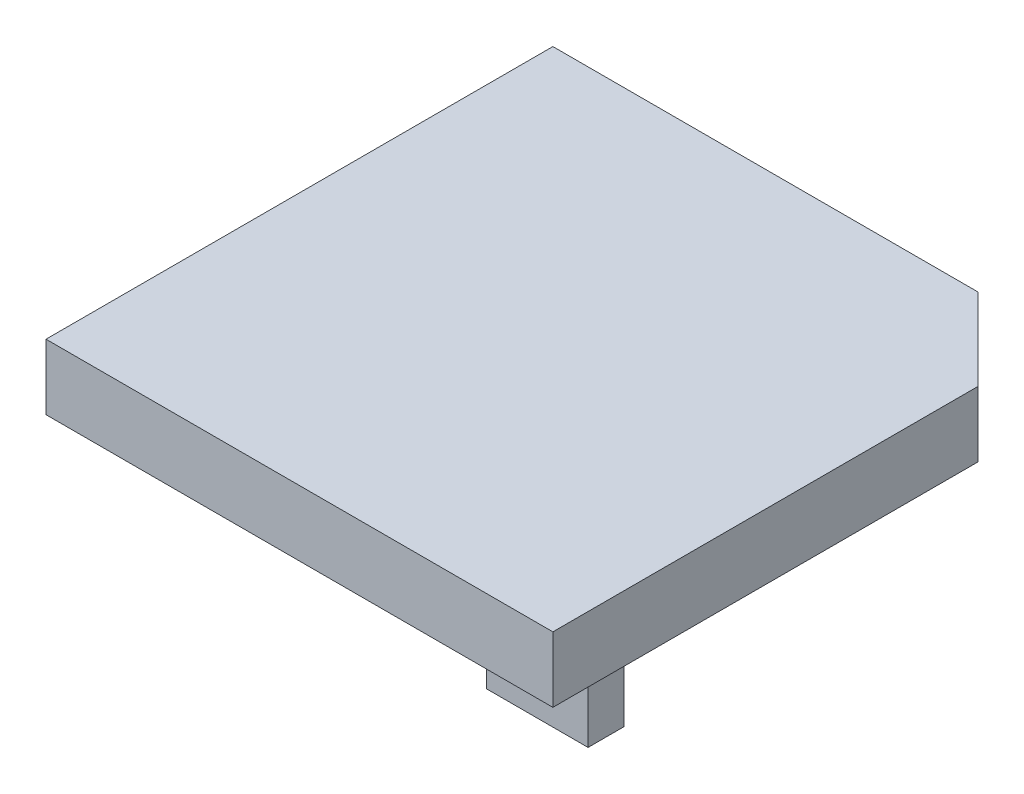
ISO-10303-21;
HEADER;
FILE_DESCRIPTION(('STEP AP214'),'2;1');
FILE_NAME('part.step','',(''),(''),'','','');
FILE_SCHEMA(('AUTOMOTIVE_DESIGN { 1 0 10303 214 1 1 1 1 }'));
ENDSEC;
DATA;
#1=APPLICATION_CONTEXT('core data for automotive mechanical design processes');
#2=APPLICATION_PROTOCOL_DEFINITION('international standard','automotive_design',2000,#1);
#3=PRODUCT_CONTEXT('',#1,'mechanical');
#4=PRODUCT('Part','Part','',(#3));
#5=PRODUCT_RELATED_PRODUCT_CATEGORY('part','',(#4));
#6=PRODUCT_DEFINITION_FORMATION('','',#4);
#7=PRODUCT_DEFINITION_CONTEXT('part definition',#1,'design');
#8=PRODUCT_DEFINITION('design','',#6,#7);
#9=PRODUCT_DEFINITION_SHAPE('','',#8);
#10=(LENGTH_UNIT() NAMED_UNIT(*) SI_UNIT(.MILLI.,.METRE.));
#11=(NAMED_UNIT(*) PLANE_ANGLE_UNIT() SI_UNIT($,.RADIAN.));
#12=(NAMED_UNIT(*) SI_UNIT($,.STERADIAN.) SOLID_ANGLE_UNIT());
#13=UNCERTAINTY_MEASURE_WITH_UNIT(LENGTH_MEASURE(1.E-05),#10,'distance_accuracy_value','');
#14=(GEOMETRIC_REPRESENTATION_CONTEXT(3) GLOBAL_UNCERTAINTY_ASSIGNED_CONTEXT((#13)) GLOBAL_UNIT_ASSIGNED_CONTEXT((#10,
#11,#12)) REPRESENTATION_CONTEXT('',''));
#15=CARTESIAN_POINT('',(0.,0.,0.));
#16=DIRECTION('',(0.,0.,1.));
#17=DIRECTION('',(1.,0.,0.));
#18=AXIS2_PLACEMENT_3D('',#15,#16,#17);
#19=CARTESIAN_POINT('',(0.,0.,0.));
#20=DIRECTION('',(0.,-1.,0.));
#21=DIRECTION('',(0.,0.,-1.));
#22=AXIS2_PLACEMENT_3D('',#19,#20,#21);
#23=PLANE('',#22);
#24=DIRECTION('',(-1.,0.,0.));
#25=VECTOR('',#24,1.);
#26=CARTESIAN_POINT('',(-9.8425,0.,-9.84250000000001));
#27=LINE('',#26,#25);
#28=CARTESIAN_POINT('',(6.6675,0.,-9.84250000000001));
#29=VERTEX_POINT('',#28);
#30=CARTESIAN_POINT('',(-9.8425,0.,-9.84250000000001));
#31=VERTEX_POINT('',#30);
#32=EDGE_CURVE('E227',#29,#31,#27,.T.);
#33=ORIENTED_EDGE('',*,*,#32,.F.);
#34=DIRECTION('',(-0.707106781186546,0.,-0.707106781186549));
#35=VECTOR('',#34,1.);
#36=CARTESIAN_POINT('',(8.25500000000001,0.,-8.25499999999999));
#37=LINE('',#36,#35);
#38=CARTESIAN_POINT('',(9.8425,0.,-6.6675));
#39=VERTEX_POINT('',#38);
#40=EDGE_CURVE('E62',#29,#39,#37,.F.);
#41=ORIENTED_EDGE('',*,*,#40,.T.);
#42=DIRECTION('',(0.,0.,-1.));
#43=VECTOR('',#42,1.);
#44=CARTESIAN_POINT('',(9.8425,0.,9.84249999999999));
#45=LINE('',#44,#43);
#46=CARTESIAN_POINT('',(9.8425,0.,9.84249999999999));
#47=VERTEX_POINT('',#46);
#48=EDGE_CURVE('E210',#47,#39,#45,.T.);
#49=ORIENTED_EDGE('',*,*,#48,.F.);
#50=DIRECTION('',(1.,0.,0.));
#51=VECTOR('',#50,1.);
#52=CARTESIAN_POINT('',(-9.8425,0.,9.8425));
#53=LINE('',#52,#51);
#54=CARTESIAN_POINT('',(-9.8425,0.,9.8425));
#55=VERTEX_POINT('',#54);
#56=EDGE_CURVE('E215',#55,#47,#53,.T.);
#57=ORIENTED_EDGE('',*,*,#56,.F.);
#58=DIRECTION('',(0.,0.,1.));
#59=VECTOR('',#58,1.);
#60=CARTESIAN_POINT('',(-9.8425,0.,9.8425));
#61=LINE('',#60,#59);
#62=EDGE_CURVE('E230',#31,#55,#61,.T.);
#63=ORIENTED_EDGE('',*,*,#62,.F.);
#64=EDGE_LOOP('',(#33,#41,#49,#57,#63));
#65=FACE_BOUND('',#64,.T.);
#66=DIRECTION('',(-1.,0.,0.));
#67=VECTOR('',#66,1.);
#68=CARTESIAN_POINT('',(-5.68325,0.,-3.11150000000001));
#69=LINE('',#68,#67);
#70=CARTESIAN_POINT('',(-4.28625,0.,-3.11150000000001));
#71=VERTEX_POINT('',#70);
#72=CARTESIAN_POINT('',(-5.68325,0.,-3.11150000000001));
#73=VERTEX_POINT('',#72);
#74=EDGE_CURVE('E168',#71,#73,#69,.T.);
#75=ORIENTED_EDGE('',*,*,#74,.F.);
#76=DIRECTION('',(0.,0.,1.));
#77=VECTOR('',#76,1.);
#78=CARTESIAN_POINT('',(-4.28625,0.,-7.04850000000001));
#79=LINE('',#78,#77);
#80=CARTESIAN_POINT('',(-4.28625,0.,-7.04850000000001));
#81=VERTEX_POINT('',#80);
#82=EDGE_CURVE('E163',#81,#71,#79,.T.);
#83=ORIENTED_EDGE('',*,*,#82,.F.);
#84=DIRECTION('',(1.,0.,0.));
#85=VECTOR('',#84,1.);
#86=CARTESIAN_POINT('',(-5.68325,0.,-7.04850000000001));
#87=LINE('',#86,#85);
#88=CARTESIAN_POINT('',(-5.68325,0.,-7.04850000000001));
#89=VERTEX_POINT('',#88);
#90=EDGE_CURVE('E179',#89,#81,#87,.T.);
#91=ORIENTED_EDGE('',*,*,#90,.F.);
#92=DIRECTION('',(0.,0.,-1.));
#93=VECTOR('',#92,1.);
#94=CARTESIAN_POINT('',(-5.68325,0.,-7.04850000000001));
#95=LINE('',#94,#93);
#96=EDGE_CURVE('E191',#73,#89,#95,.T.);
#97=ORIENTED_EDGE('',*,*,#96,.F.);
#98=EDGE_LOOP('',(#75,#83,#91,#97));
#99=FACE_BOUND('',#98,.T.);
#100=DIRECTION('',(-1.,0.,0.));
#101=VECTOR('',#100,1.);
#102=CARTESIAN_POINT('',(3.3655,0.,5.93598));
#103=LINE('',#102,#101);
#104=CARTESIAN_POINT('',(7.3025,0.,5.93598));
#105=VERTEX_POINT('',#104);
#106=CARTESIAN_POINT('',(3.3655,0.,5.93598));
#107=VERTEX_POINT('',#106);
#108=EDGE_CURVE('E432',#105,#107,#103,.T.);
#109=ORIENTED_EDGE('',*,*,#108,.F.);
#110=DIRECTION('',(0.,0.,1.));
#111=VECTOR('',#110,1.);
#112=CARTESIAN_POINT('',(7.3025,0.,4.53898));
#113=LINE('',#112,#111);
#114=CARTESIAN_POINT('',(7.3025,0.,4.53898));
#115=VERTEX_POINT('',#114);
#116=EDGE_CURVE('E160',#115,#105,#113,.T.);
#117=ORIENTED_EDGE('',*,*,#116,.F.);
#118=DIRECTION('',(1.,0.,0.));
#119=VECTOR('',#118,1.);
#120=CARTESIAN_POINT('',(3.3655,0.,4.53898));
#121=LINE('',#120,#119);
#122=CARTESIAN_POINT('',(3.3655,0.,4.53898));
#123=VERTEX_POINT('',#122);
#124=EDGE_CURVE('E156',#123,#115,#121,.T.);
#125=ORIENTED_EDGE('',*,*,#124,.F.);
#126=DIRECTION('',(0.,0.,-1.));
#127=VECTOR('',#126,1.);
#128=CARTESIAN_POINT('',(3.3655,0.,4.53898));
#129=LINE('',#128,#127);
#130=EDGE_CURVE('E428',#107,#123,#129,.T.);
#131=ORIENTED_EDGE('',*,*,#130,.F.);
#132=EDGE_LOOP('',(#109,#117,#125,#131));
#133=FACE_BOUND('',#132,.T.);
#134=ADVANCED_FACE('F39',(#65,#99,#133),#23,.T.);
#135=CARTESIAN_POINT('',(9.8425,2.54,9.84249999999999));
#136=DIRECTION('',(-1.,0.,0.));
#137=DIRECTION('',(0.,0.,1.));
#138=AXIS2_PLACEMENT_3D('',#135,#136,#137);
#139=PLANE('',#138);
#140=ORIENTED_EDGE('',*,*,#48,.T.);
#141=DIRECTION('',(0.,1.,0.));
#142=VECTOR('',#141,1.);
#143=CARTESIAN_POINT('',(9.8425,2.54,-6.6675));
#144=LINE('',#143,#142);
#145=CARTESIAN_POINT('',(9.8425,2.54,-6.6675));
#146=VERTEX_POINT('',#145);
#147=EDGE_CURVE('E48',#39,#146,#144,.T.);
#148=ORIENTED_EDGE('',*,*,#147,.T.);
#149=DIRECTION('',(0.,0.,-1.));
#150=VECTOR('',#149,1.);
#151=CARTESIAN_POINT('',(9.8425,2.54,9.84249999999999));
#152=LINE('',#151,#150);
#153=CARTESIAN_POINT('',(9.8425,2.54,9.84249999999999));
#154=VERTEX_POINT('',#153);
#155=EDGE_CURVE('E211',#154,#146,#152,.T.);
#156=ORIENTED_EDGE('',*,*,#155,.F.);
#157=DIRECTION('',(0.,-1.,0.));
#158=VECTOR('',#157,1.);
#159=CARTESIAN_POINT('',(9.8425,2.54,9.84249999999999));
#160=LINE('',#159,#158);
#161=EDGE_CURVE('E224',#154,#47,#160,.T.);
#162=ORIENTED_EDGE('',*,*,#161,.T.);
#163=EDGE_LOOP('',(#140,#148,#156,#162));
#164=FACE_BOUND('',#163,.T.);
#165=ADVANCED_FACE('F279',(#164),#139,.F.);
#166=CARTESIAN_POINT('',(-9.8425,2.54,-9.84250000000001));
#167=DIRECTION('',(0.,0.,1.));
#168=DIRECTION('',(1.,0.,0.));
#169=AXIS2_PLACEMENT_3D('',#166,#167,#168);
#170=PLANE('',#169);
#171=DIRECTION('',(-1.,0.,0.));
#172=VECTOR('',#171,1.);
#173=CARTESIAN_POINT('',(-9.8425,2.54,-9.84250000000001));
#174=LINE('',#173,#172);
#175=CARTESIAN_POINT('',(6.6675,2.54,-9.84250000000001));
#176=VERTEX_POINT('',#175);
#177=CARTESIAN_POINT('',(-9.8425,2.54,-9.84250000000001));
#178=VERTEX_POINT('',#177);
#179=EDGE_CURVE('E214',#176,#178,#174,.T.);
#180=ORIENTED_EDGE('',*,*,#179,.F.);
#181=DIRECTION('',(0.,-1.,0.));
#182=VECTOR('',#181,1.);
#183=CARTESIAN_POINT('',(6.6675,2.54,-9.84250000000001));
#184=LINE('',#183,#182);
#185=EDGE_CURVE('E246',#176,#29,#184,.T.);
#186=ORIENTED_EDGE('',*,*,#185,.T.);
#187=ORIENTED_EDGE('',*,*,#32,.T.);
#188=DIRECTION('',(0.,-1.,0.));
#189=VECTOR('',#188,1.);
#190=CARTESIAN_POINT('',(-9.8425,2.54,-9.84250000000001));
#191=LINE('',#190,#189);
#192=EDGE_CURVE('E242',#178,#31,#191,.T.);
#193=ORIENTED_EDGE('',*,*,#192,.F.);
#194=EDGE_LOOP('',(#180,#186,#187,#193));
#195=FACE_BOUND('',#194,.T.);
#196=ADVANCED_FACE('F255',(#195),#170,.F.);
#197=CARTESIAN_POINT('',(-9.8425,2.54,9.8425));
#198=DIRECTION('',(1.,0.,0.));
#199=DIRECTION('',(0.,0.,-1.));
#200=AXIS2_PLACEMENT_3D('',#197,#198,#199);
#201=PLANE('',#200);
#202=ORIENTED_EDGE('',*,*,#62,.T.);
#203=DIRECTION('',(0.,-1.,0.));
#204=VECTOR('',#203,1.);
#205=CARTESIAN_POINT('',(-9.8425,2.54,9.8425));
#206=LINE('',#205,#204);
#207=CARTESIAN_POINT('',(-9.8425,2.54,9.8425));
#208=VERTEX_POINT('',#207);
#209=EDGE_CURVE('E238',#208,#55,#206,.T.);
#210=ORIENTED_EDGE('',*,*,#209,.F.);
#211=DIRECTION('',(0.,0.,1.));
#212=VECTOR('',#211,1.);
#213=CARTESIAN_POINT('',(-9.8425,2.54,9.8425));
#214=LINE('',#213,#212);
#215=EDGE_CURVE('E218',#178,#208,#214,.T.);
#216=ORIENTED_EDGE('',*,*,#215,.F.);
#217=ORIENTED_EDGE('',*,*,#192,.T.);
#218=EDGE_LOOP('',(#202,#210,#216,#217));
#219=FACE_BOUND('',#218,.T.);
#220=ADVANCED_FACE('F264',(#219),#201,.F.);
#221=CARTESIAN_POINT('',(-9.8425,2.54,9.8425));
#222=DIRECTION('',(0.,0.,-1.));
#223=DIRECTION('',(-1.,0.,0.));
#224=AXIS2_PLACEMENT_3D('',#221,#222,#223);
#225=PLANE('',#224);
#226=ORIENTED_EDGE('',*,*,#56,.T.);
#227=ORIENTED_EDGE('',*,*,#161,.F.);
#228=DIRECTION('',(1.,0.,0.));
#229=VECTOR('',#228,1.);
#230=CARTESIAN_POINT('',(-9.8425,2.54,9.8425));
#231=LINE('',#230,#229);
#232=EDGE_CURVE('E221',#208,#154,#231,.T.);
#233=ORIENTED_EDGE('',*,*,#232,.F.);
#234=ORIENTED_EDGE('',*,*,#209,.T.);
#235=EDGE_LOOP('',(#226,#227,#233,#234));
#236=FACE_BOUND('',#235,.T.);
#237=ADVANCED_FACE('F268',(#236),#225,.F.);
#238=CARTESIAN_POINT('',(0.,2.54,0.));
#239=DIRECTION('',(0.,-1.,0.));
#240=DIRECTION('',(0.,0.,-1.));
#241=AXIS2_PLACEMENT_3D('',#238,#239,#240);
#242=PLANE('',#241);
#243=ORIENTED_EDGE('',*,*,#155,.T.);
#244=DIRECTION('',(0.707106781186546,0.,0.707106781186549));
#245=VECTOR('',#244,1.);
#246=CARTESIAN_POINT('',(6.6675,2.54,-9.84250000000001));
#247=LINE('',#246,#245);
#248=EDGE_CURVE('E11',#146,#176,#247,.F.);
#249=ORIENTED_EDGE('',*,*,#248,.T.);
#250=ORIENTED_EDGE('',*,*,#179,.T.);
#251=ORIENTED_EDGE('',*,*,#215,.T.);
#252=ORIENTED_EDGE('',*,*,#232,.T.);
#253=EDGE_LOOP('',(#243,#249,#250,#251,#252));
#254=FACE_BOUND('',#253,.T.);
#255=ADVANCED_FACE('F271',(#254),#242,.F.);
#256=CARTESIAN_POINT('',(-4.28625,-4.572,-7.04850000000001));
#257=DIRECTION('',(-1.,0.,0.));
#258=DIRECTION('',(0.,0.,1.));
#259=AXIS2_PLACEMENT_3D('',#256,#257,#258);
#260=PLANE('',#259);
#261=ORIENTED_EDGE('',*,*,#82,.T.);
#262=DIRECTION('',(0.,1.,0.));
#263=VECTOR('',#262,1.);
#264=CARTESIAN_POINT('',(-4.28625,-4.572,-3.11150000000001));
#265=LINE('',#264,#263);
#266=CARTESIAN_POINT('',(-4.28625,-4.572,-3.11150000000001));
#267=VERTEX_POINT('',#266);
#268=EDGE_CURVE('E207',#267,#71,#265,.T.);
#269=ORIENTED_EDGE('',*,*,#268,.F.);
#270=DIRECTION('',(0.,0.,1.));
#271=VECTOR('',#270,1.);
#272=CARTESIAN_POINT('',(-4.28625,-4.572,-7.04850000000001));
#273=LINE('',#272,#271);
#274=CARTESIAN_POINT('',(-4.28625,-4.572,-7.04850000000001));
#275=VERTEX_POINT('',#274);
#276=EDGE_CURVE('E174',#275,#267,#273,.T.);
#277=ORIENTED_EDGE('',*,*,#276,.F.);
#278=DIRECTION('',(0.,1.,0.));
#279=VECTOR('',#278,1.);
#280=CARTESIAN_POINT('',(-4.28625,-4.572,-7.04850000000001));
#281=LINE('',#280,#279);
#282=EDGE_CURVE('E187',#275,#81,#281,.T.);
#283=ORIENTED_EDGE('',*,*,#282,.T.);
#284=EDGE_LOOP('',(#261,#269,#277,#283));
#285=FACE_BOUND('',#284,.T.);
#286=ADVANCED_FACE('F311',(#285),#260,.F.);
#287=CARTESIAN_POINT('',(-5.68325,-4.572,-3.11150000000001));
#288=DIRECTION('',(0.,0.,-1.));
#289=DIRECTION('',(-1.,0.,0.));
#290=AXIS2_PLACEMENT_3D('',#287,#288,#289);
#291=PLANE('',#290);
#292=ORIENTED_EDGE('',*,*,#74,.T.);
#293=DIRECTION('',(0.,1.,0.));
#294=VECTOR('',#293,1.);
#295=CARTESIAN_POINT('',(-5.68325,-4.572,-3.11150000000001));
#296=LINE('',#295,#294);
#297=CARTESIAN_POINT('',(-5.68325,-4.572,-3.11150000000001));
#298=VERTEX_POINT('',#297);
#299=EDGE_CURVE('E203',#298,#73,#296,.T.);
#300=ORIENTED_EDGE('',*,*,#299,.F.);
#301=DIRECTION('',(-1.,0.,0.));
#302=VECTOR('',#301,1.);
#303=CARTESIAN_POINT('',(-5.68325,-4.572,-3.11150000000001));
#304=LINE('',#303,#302);
#305=EDGE_CURVE('E178',#267,#298,#304,.T.);
#306=ORIENTED_EDGE('',*,*,#305,.F.);
#307=ORIENTED_EDGE('',*,*,#268,.T.);
#308=EDGE_LOOP('',(#292,#300,#306,#307));
#309=FACE_BOUND('',#308,.T.);
#310=ADVANCED_FACE('F316',(#309),#291,.F.);
#311=CARTESIAN_POINT('',(-5.68325,-4.572,-7.04850000000001));
#312=DIRECTION('',(1.,0.,0.));
#313=DIRECTION('',(0.,0.,-1.));
#314=AXIS2_PLACEMENT_3D('',#311,#312,#313);
#315=PLANE('',#314);
#316=ORIENTED_EDGE('',*,*,#96,.T.);
#317=DIRECTION('',(0.,1.,0.));
#318=VECTOR('',#317,1.);
#319=CARTESIAN_POINT('',(-5.68325,-4.572,-7.04850000000001));
#320=LINE('',#319,#318);
#321=CARTESIAN_POINT('',(-5.68325,-4.572,-7.04850000000001));
#322=VERTEX_POINT('',#321);
#323=EDGE_CURVE('E200',#322,#89,#320,.T.);
#324=ORIENTED_EDGE('',*,*,#323,.F.);
#325=DIRECTION('',(0.,0.,-1.));
#326=VECTOR('',#325,1.);
#327=CARTESIAN_POINT('',(-5.68325,-4.572,-7.04850000000001));
#328=LINE('',#327,#326);
#329=EDGE_CURVE('E182',#298,#322,#328,.T.);
#330=ORIENTED_EDGE('',*,*,#329,.F.);
#331=ORIENTED_EDGE('',*,*,#299,.T.);
#332=EDGE_LOOP('',(#316,#324,#330,#331));
#333=FACE_BOUND('',#332,.T.);
#334=ADVANCED_FACE('F323',(#333),#315,.F.);
#335=CARTESIAN_POINT('',(-5.68325,-4.572,-7.04850000000001));
#336=DIRECTION('',(0.,0.,1.));
#337=DIRECTION('',(1.,0.,0.));
#338=AXIS2_PLACEMENT_3D('',#335,#336,#337);
#339=PLANE('',#338);
#340=ORIENTED_EDGE('',*,*,#90,.T.);
#341=ORIENTED_EDGE('',*,*,#282,.F.);
#342=DIRECTION('',(1.,0.,0.));
#343=VECTOR('',#342,1.);
#344=CARTESIAN_POINT('',(-5.68325,-4.572,-7.04850000000001));
#345=LINE('',#344,#343);
#346=EDGE_CURVE('E185',#322,#275,#345,.T.);
#347=ORIENTED_EDGE('',*,*,#346,.F.);
#348=ORIENTED_EDGE('',*,*,#323,.T.);
#349=EDGE_LOOP('',(#340,#341,#347,#348));
#350=FACE_BOUND('',#349,.T.);
#351=ADVANCED_FACE('F331',(#350),#339,.F.);
#352=CARTESIAN_POINT('',(0.,-4.572,0.));
#353=DIRECTION('',(0.,1.,0.));
#354=DIRECTION('',(0.,0.,1.));
#355=AXIS2_PLACEMENT_3D('',#352,#353,#354);
#356=PLANE('',#355);
#357=ORIENTED_EDGE('',*,*,#276,.T.);
#358=ORIENTED_EDGE('',*,*,#305,.T.);
#359=ORIENTED_EDGE('',*,*,#329,.T.);
#360=ORIENTED_EDGE('',*,*,#346,.T.);
#361=EDGE_LOOP('',(#357,#358,#359,#360));
#362=FACE_BOUND('',#361,.T.);
#363=ADVANCED_FACE('F339',(#362),#356,.F.);
#364=CARTESIAN_POINT('',(7.3025,-4.572,4.53898));
#365=DIRECTION('',(-1.,0.,0.));
#366=DIRECTION('',(0.,0.,1.));
#367=AXIS2_PLACEMENT_3D('',#364,#365,#366);
#368=PLANE('',#367);
#369=ORIENTED_EDGE('',*,*,#116,.T.);
#370=DIRECTION('',(0.,1.,0.));
#371=VECTOR('',#370,1.);
#372=CARTESIAN_POINT('',(7.3025,-4.572,5.93598));
#373=LINE('',#372,#371);
#374=CARTESIAN_POINT('',(7.3025,-4.572,5.93598));
#375=VERTEX_POINT('',#374);
#376=EDGE_CURVE('E138',#375,#105,#373,.T.);
#377=ORIENTED_EDGE('',*,*,#376,.F.);
#378=DIRECTION('',(0.,0.,1.));
#379=VECTOR('',#378,1.);
#380=CARTESIAN_POINT('',(7.3025,-4.572,4.53898));
#381=LINE('',#380,#379);
#382=CARTESIAN_POINT('',(7.3025,-4.572,4.53898));
#383=VERTEX_POINT('',#382);
#384=EDGE_CURVE('E146',#383,#375,#381,.T.);
#385=ORIENTED_EDGE('',*,*,#384,.F.);
#386=DIRECTION('',(0.,1.,0.));
#387=VECTOR('',#386,1.);
#388=CARTESIAN_POINT('',(7.3025,-4.572,4.53898));
#389=LINE('',#388,#387);
#390=EDGE_CURVE('E422',#383,#115,#389,.T.);
#391=ORIENTED_EDGE('',*,*,#390,.T.);
#392=EDGE_LOOP('',(#369,#377,#385,#391));
#393=FACE_BOUND('',#392,.T.);
#394=ADVANCED_FACE('F158',(#393),#368,.F.);
#395=CARTESIAN_POINT('',(3.3655,-4.572,5.93598));
#396=DIRECTION('',(0.,0.,-1.));
#397=DIRECTION('',(-1.,0.,0.));
#398=AXIS2_PLACEMENT_3D('',#395,#396,#397);
#399=PLANE('',#398);
#400=ORIENTED_EDGE('',*,*,#108,.T.);
#401=DIRECTION('',(0.,1.,0.));
#402=VECTOR('',#401,1.);
#403=CARTESIAN_POINT('',(3.3655,-4.572,5.93598));
#404=LINE('',#403,#402);
#405=CARTESIAN_POINT('',(3.3655,-4.572,5.93598));
#406=VERTEX_POINT('',#405);
#407=EDGE_CURVE('E141',#406,#107,#404,.T.);
#408=ORIENTED_EDGE('',*,*,#407,.F.);
#409=DIRECTION('',(-1.,0.,0.));
#410=VECTOR('',#409,1.);
#411=CARTESIAN_POINT('',(3.3655,-4.572,5.93598));
#412=LINE('',#411,#410);
#413=EDGE_CURVE('E134',#375,#406,#412,.T.);
#414=ORIENTED_EDGE('',*,*,#413,.F.);
#415=ORIENTED_EDGE('',*,*,#376,.T.);
#416=EDGE_LOOP('',(#400,#408,#414,#415));
#417=FACE_BOUND('',#416,.T.);
#418=ADVANCED_FACE('F136',(#417),#399,.F.);
#419=CARTESIAN_POINT('',(3.3655,-4.572,4.53898));
#420=DIRECTION('',(1.,0.,0.));
#421=DIRECTION('',(0.,0.,-1.));
#422=AXIS2_PLACEMENT_3D('',#419,#420,#421);
#423=PLANE('',#422);
#424=ORIENTED_EDGE('',*,*,#130,.T.);
#425=DIRECTION('',(0.,1.,0.));
#426=VECTOR('',#425,1.);
#427=CARTESIAN_POINT('',(3.3655,-4.572,4.53898));
#428=LINE('',#427,#426);
#429=CARTESIAN_POINT('',(3.3655,-4.572,4.53898));
#430=VERTEX_POINT('',#429);
#431=EDGE_CURVE('E170',#430,#123,#428,.T.);
#432=ORIENTED_EDGE('',*,*,#431,.F.);
#433=DIRECTION('',(0.,0.,-1.));
#434=VECTOR('',#433,1.);
#435=CARTESIAN_POINT('',(3.3655,-4.572,4.53898));
#436=LINE('',#435,#434);
#437=EDGE_CURVE('E145',#406,#430,#436,.T.);
#438=ORIENTED_EDGE('',*,*,#437,.F.);
#439=ORIENTED_EDGE('',*,*,#407,.T.);
#440=EDGE_LOOP('',(#424,#432,#438,#439));
#441=FACE_BOUND('',#440,.T.);
#442=ADVANCED_FACE('F360',(#441),#423,.F.);
#443=CARTESIAN_POINT('',(3.3655,-4.572,4.53898));
#444=DIRECTION('',(0.,0.,1.));
#445=DIRECTION('',(1.,0.,0.));
#446=AXIS2_PLACEMENT_3D('',#443,#444,#445);
#447=PLANE('',#446);
#448=ORIENTED_EDGE('',*,*,#124,.T.);
#449=ORIENTED_EDGE('',*,*,#390,.F.);
#450=DIRECTION('',(1.,0.,0.));
#451=VECTOR('',#450,1.);
#452=CARTESIAN_POINT('',(3.3655,-4.572,4.53898));
#453=LINE('',#452,#451);
#454=EDGE_CURVE('E151',#430,#383,#453,.T.);
#455=ORIENTED_EDGE('',*,*,#454,.F.);
#456=ORIENTED_EDGE('',*,*,#431,.T.);
#457=EDGE_LOOP('',(#448,#449,#455,#456));
#458=FACE_BOUND('',#457,.T.);
#459=ADVANCED_FACE('F276',(#458),#447,.F.);
#460=CARTESIAN_POINT('',(0.,-4.572,0.));
#461=DIRECTION('',(0.,1.,0.));
#462=DIRECTION('',(0.,0.,1.));
#463=AXIS2_PLACEMENT_3D('',#460,#461,#462);
#464=PLANE('',#463);
#465=ORIENTED_EDGE('',*,*,#384,.T.);
#466=ORIENTED_EDGE('',*,*,#413,.T.);
#467=ORIENTED_EDGE('',*,*,#437,.T.);
#468=ORIENTED_EDGE('',*,*,#454,.T.);
#469=EDGE_LOOP('',(#465,#466,#467,#468));
#470=FACE_BOUND('',#469,.T.);
#471=ADVANCED_FACE('F149',(#470),#464,.F.);
#472=CARTESIAN_POINT('',(6.6675,2.54,-9.84250000000001));
#473=DIRECTION('',(-0.707106781186549,0.,0.707106781186546));
#474=DIRECTION('',(0.,-1.,0.));
#475=AXIS2_PLACEMENT_3D('',#472,#473,#474);
#476=PLANE('',#475);
#477=ORIENTED_EDGE('',*,*,#248,.F.);
#478=ORIENTED_EDGE('',*,*,#147,.F.);
#479=ORIENTED_EDGE('',*,*,#40,.F.);
#480=ORIENTED_EDGE('',*,*,#185,.F.);
#481=EDGE_LOOP('',(#477,#478,#479,#480));
#482=FACE_BOUND('',#481,.T.);
#483=ADVANCED_FACE('F41',(#482),#476,.F.);
#484=CLOSED_SHELL('',(#134,#165,#196,#220,#237,#255,#286,#310,#334,#351,#363,#394,#418,#442,
#459,#471,#483));
#485=MANIFOLD_SOLID_BREP('B2',#484);
#486=ADVANCED_BREP_SHAPE_REPRESENTATION('',(#18,#485),#14);
#487=SHAPE_DEFINITION_REPRESENTATION(#9,#486);
ENDSEC;
END-ISO-10303-21;
